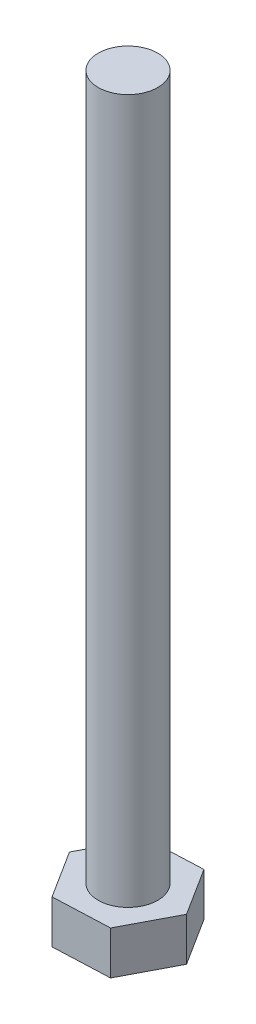
ISO-10303-21;
HEADER;
FILE_DESCRIPTION(('STEP AP214'),'2;1');
FILE_NAME('part.step','',(''),(''),'','','');
FILE_SCHEMA(('AUTOMOTIVE_DESIGN { 1 0 10303 214 1 1 1 1 }'));
ENDSEC;
DATA;
#1=APPLICATION_CONTEXT('core data for automotive mechanical design processes');
#2=APPLICATION_PROTOCOL_DEFINITION('international standard','automotive_design',2000,#1);
#3=PRODUCT_CONTEXT('',#1,'mechanical');
#4=PRODUCT('Part','Part','',(#3));
#5=PRODUCT_RELATED_PRODUCT_CATEGORY('part','',(#4));
#6=PRODUCT_DEFINITION_FORMATION('','',#4);
#7=PRODUCT_DEFINITION_CONTEXT('part definition',#1,'design');
#8=PRODUCT_DEFINITION('design','',#6,#7);
#9=PRODUCT_DEFINITION_SHAPE('','',#8);
#10=(LENGTH_UNIT() NAMED_UNIT(*) SI_UNIT(.MILLI.,.METRE.));
#11=(NAMED_UNIT(*) PLANE_ANGLE_UNIT() SI_UNIT($,.RADIAN.));
#12=(NAMED_UNIT(*) SI_UNIT($,.STERADIAN.) SOLID_ANGLE_UNIT());
#13=UNCERTAINTY_MEASURE_WITH_UNIT(LENGTH_MEASURE(1.E-05),#10,'distance_accuracy_value','');
#14=(GEOMETRIC_REPRESENTATION_CONTEXT(3) GLOBAL_UNCERTAINTY_ASSIGNED_CONTEXT((#13)) GLOBAL_UNIT_ASSIGNED_CONTEXT((#10,
#11,#12)) REPRESENTATION_CONTEXT('',''));
#15=CARTESIAN_POINT('',(0.,0.,0.));
#16=DIRECTION('',(0.,0.,1.));
#17=DIRECTION('',(1.,0.,0.));
#18=AXIS2_PLACEMENT_3D('',#15,#16,#17);
#19=CARTESIAN_POINT('',(4.82045610999337,8.,-9.2066933744764));
#20=DIRECTION('',(0.0412525656755766,0.,0.99914875059982));
#21=DIRECTION('',(0.99914875059982,0.,-0.0412525656755766));
#22=AXIS2_PLACEMENT_3D('',#19,#20,#21);
#23=PLANE('',#22);
#24=DIRECTION('',(-0.99914875059982,0.,0.0412525656755766));
#25=VECTOR('',#24,1.);
#26=CARTESIAN_POINT('',(4.82045610999337,0.,-9.2066933744764));
#27=LINE('',#26,#25);
#28=CARTESIAN_POINT('',(4.82045610999337,0.,-9.2066933744764));
#29=VERTEX_POINT('',#28);
#30=CARTESIAN_POINT('',(-5.56300229215375,0.,-8.77798413632038));
#31=VERTEX_POINT('',#30);
#32=EDGE_CURVE('E127',#29,#31,#27,.T.);
#33=ORIENTED_EDGE('',*,*,#32,.T.);
#34=DIRECTION('',(0.,-1.,0.));
#35=VECTOR('',#34,1.);
#36=CARTESIAN_POINT('',(-5.56300229215375,8.,-8.77798413632038));
#37=LINE('',#36,#35);
#38=CARTESIAN_POINT('',(-5.56300229215375,8.,-8.77798413632038));
#39=VERTEX_POINT('',#38);
#40=EDGE_CURVE('E44',#39,#31,#37,.T.);
#41=ORIENTED_EDGE('',*,*,#40,.F.);
#42=DIRECTION('',(-0.99914875059982,0.,0.0412525656755766));
#43=VECTOR('',#42,1.);
#44=CARTESIAN_POINT('',(4.82045610999337,8.,-9.2066933744764));
#45=LINE('',#44,#43);
#46=CARTESIAN_POINT('',(4.82045610999337,8.,-9.2066933744764));
#47=VERTEX_POINT('',#46);
#48=EDGE_CURVE('E138',#47,#39,#45,.T.);
#49=ORIENTED_EDGE('',*,*,#48,.F.);
#50=DIRECTION('',(0.,-1.,0.));
#51=VECTOR('',#50,1.);
#52=CARTESIAN_POINT('',(4.82045610999337,8.,-9.2066933744764));
#53=LINE('',#52,#51);
#54=EDGE_CURVE('E123',#47,#29,#53,.T.);
#55=ORIENTED_EDGE('',*,*,#54,.T.);
#56=EDGE_LOOP('',(#33,#41,#49,#55));
#57=FACE_BOUND('',#56,.T.);
#58=ADVANCED_FACE('F41',(#57),#23,.F.);
#59=CARTESIAN_POINT('',(-5.56300229215375,8.,-8.77798413632038));
#60=DIRECTION('',(0.885914483016715,0.,0.463848605453575));
#61=DIRECTION('',(0.463848605453575,0.,-0.885914483016715));
#62=AXIS2_PLACEMENT_3D('',#59,#60,#61);
#63=PLANE('',#62);
#64=DIRECTION('',(-0.463848605453575,0.,0.885914483016715));
#65=VECTOR('',#64,1.);
#66=CARTESIAN_POINT('',(-5.56300229215375,0.,-8.77798413632038));
#67=LINE('',#66,#65);
#68=CARTESIAN_POINT('',(-10.3834584021471,0.,0.428709238156027));
#69=VERTEX_POINT('',#68);
#70=EDGE_CURVE('E130',#31,#69,#67,.T.);
#71=ORIENTED_EDGE('',*,*,#70,.T.);
#72=DIRECTION('',(0.,-1.,0.));
#73=VECTOR('',#72,1.);
#74=CARTESIAN_POINT('',(-10.3834584021471,8.,0.428709238156027));
#75=LINE('',#74,#73);
#76=CARTESIAN_POINT('',(-10.3834584021471,8.,0.428709238156027));
#77=VERTEX_POINT('',#76);
#78=EDGE_CURVE('E141',#77,#69,#75,.T.);
#79=ORIENTED_EDGE('',*,*,#78,.F.);
#80=DIRECTION('',(-0.463848605453575,0.,0.885914483016715));
#81=VECTOR('',#80,1.);
#82=CARTESIAN_POINT('',(-5.56300229215375,8.,-8.77798413632038));
#83=LINE('',#82,#81);
#84=EDGE_CURVE('E96',#39,#77,#83,.T.);
#85=ORIENTED_EDGE('',*,*,#84,.F.);
#86=ORIENTED_EDGE('',*,*,#40,.T.);
#87=EDGE_LOOP('',(#71,#79,#85,#86));
#88=FACE_BOUND('',#87,.T.);
#89=ADVANCED_FACE('F146',(#88),#63,.F.);
#90=CARTESIAN_POINT('',(-10.3834584021471,8.,0.428709238156027));
#91=DIRECTION('',(0.844661917341139,0.,-0.535300145146246));
#92=DIRECTION('',(-0.535300145146246,0.,-0.844661917341139));
#93=AXIS2_PLACEMENT_3D('',#90,#91,#92);
#94=PLANE('',#93);
#95=DIRECTION('',(0.535300145146246,0.,0.844661917341139));
#96=VECTOR('',#95,1.);
#97=CARTESIAN_POINT('',(-10.3834584021471,0.,0.428709238156027));
#98=LINE('',#97,#96);
#99=CARTESIAN_POINT('',(-4.82045610999337,0.,9.2066933744764));
#100=VERTEX_POINT('',#99);
#101=EDGE_CURVE('E133',#69,#100,#98,.T.);
#102=ORIENTED_EDGE('',*,*,#101,.T.);
#103=DIRECTION('',(0.,-1.,0.));
#104=VECTOR('',#103,1.);
#105=CARTESIAN_POINT('',(-4.82045610999337,8.,9.2066933744764));
#106=LINE('',#105,#104);
#107=CARTESIAN_POINT('',(-4.82045610999337,8.,9.2066933744764));
#108=VERTEX_POINT('',#107);
#109=EDGE_CURVE('E118',#108,#100,#106,.T.);
#110=ORIENTED_EDGE('',*,*,#109,.F.);
#111=DIRECTION('',(0.535300145146246,0.,0.844661917341139));
#112=VECTOR('',#111,1.);
#113=CARTESIAN_POINT('',(-10.3834584021471,8.,0.428709238156027));
#114=LINE('',#113,#112);
#115=EDGE_CURVE('E109',#77,#108,#114,.T.);
#116=ORIENTED_EDGE('',*,*,#115,.F.);
#117=ORIENTED_EDGE('',*,*,#78,.T.);
#118=EDGE_LOOP('',(#102,#110,#116,#117));
#119=FACE_BOUND('',#118,.T.);
#120=ADVANCED_FACE('F152',(#119),#94,.F.);
#121=CARTESIAN_POINT('',(-4.82045610999337,8.,9.2066933744764));
#122=DIRECTION('',(-0.0412525656755766,0.,-0.99914875059982));
#123=DIRECTION('',(-0.99914875059982,0.,0.0412525656755766));
#124=AXIS2_PLACEMENT_3D('',#121,#122,#123);
#125=PLANE('',#124);
#126=DIRECTION('',(0.99914875059982,0.,-0.0412525656755766));
#127=VECTOR('',#126,1.);
#128=CARTESIAN_POINT('',(-4.82045610999337,0.,9.2066933744764));
#129=LINE('',#128,#127);
#130=CARTESIAN_POINT('',(5.56300229215375,0.,8.77798413632038));
#131=VERTEX_POINT('',#130);
#132=EDGE_CURVE('E117',#100,#131,#129,.T.);
#133=ORIENTED_EDGE('',*,*,#132,.T.);
#134=DIRECTION('',(0.,-1.,0.));
#135=VECTOR('',#134,1.);
#136=CARTESIAN_POINT('',(5.56300229215375,8.,8.77798413632038));
#137=LINE('',#136,#135);
#138=CARTESIAN_POINT('',(5.56300229215375,8.,8.77798413632038));
#139=VERTEX_POINT('',#138);
#140=EDGE_CURVE('E114',#139,#131,#137,.T.);
#141=ORIENTED_EDGE('',*,*,#140,.F.);
#142=DIRECTION('',(0.99914875059982,0.,-0.0412525656755766));
#143=VECTOR('',#142,1.);
#144=CARTESIAN_POINT('',(-4.82045610999337,8.,9.2066933744764));
#145=LINE('',#144,#143);
#146=EDGE_CURVE('E103',#108,#139,#145,.T.);
#147=ORIENTED_EDGE('',*,*,#146,.F.);
#148=ORIENTED_EDGE('',*,*,#109,.T.);
#149=EDGE_LOOP('',(#133,#141,#147,#148));
#150=FACE_BOUND('',#149,.T.);
#151=ADVANCED_FACE('F115',(#150),#125,.F.);
#152=CARTESIAN_POINT('',(5.56300229215375,8.,8.77798413632038));
#153=DIRECTION('',(-0.885914483016715,0.,-0.463848605453575));
#154=DIRECTION('',(-0.463848605453575,0.,0.885914483016715));
#155=AXIS2_PLACEMENT_3D('',#152,#153,#154);
#156=PLANE('',#155);
#157=DIRECTION('',(0.463848605453575,0.,-0.885914483016715));
#158=VECTOR('',#157,1.);
#159=CARTESIAN_POINT('',(5.56300229215375,0.,8.77798413632038));
#160=LINE('',#159,#158);
#161=CARTESIAN_POINT('',(10.3834584021471,0.,-0.428709238156026));
#162=VERTEX_POINT('',#161);
#163=EDGE_CURVE('E81',#131,#162,#160,.T.);
#164=ORIENTED_EDGE('',*,*,#163,.T.);
#165=DIRECTION('',(0.,-1.,0.));
#166=VECTOR('',#165,1.);
#167=CARTESIAN_POINT('',(10.3834584021471,8.,-0.428709238156026));
#168=LINE('',#167,#166);
#169=CARTESIAN_POINT('',(10.3834584021471,8.,-0.428709238156026));
#170=VERTEX_POINT('',#169);
#171=EDGE_CURVE('E119',#170,#162,#168,.T.);
#172=ORIENTED_EDGE('',*,*,#171,.F.);
#173=DIRECTION('',(0.463848605453575,0.,-0.885914483016715));
#174=VECTOR('',#173,1.);
#175=CARTESIAN_POINT('',(5.56300229215375,8.,8.77798413632038));
#176=LINE('',#175,#174);
#177=EDGE_CURVE('E107',#139,#170,#176,.T.);
#178=ORIENTED_EDGE('',*,*,#177,.F.);
#179=ORIENTED_EDGE('',*,*,#140,.T.);
#180=EDGE_LOOP('',(#164,#172,#178,#179));
#181=FACE_BOUND('',#180,.T.);
#182=ADVANCED_FACE('F121',(#181),#156,.F.);
#183=CARTESIAN_POINT('',(10.3834584021471,8.,-0.428709238156026));
#184=DIRECTION('',(-0.844661917341139,0.,0.535300145146246));
#185=DIRECTION('',(0.535300145146246,0.,0.844661917341139));
#186=AXIS2_PLACEMENT_3D('',#183,#184,#185);
#187=PLANE('',#186);
#188=DIRECTION('',(-0.535300145146246,0.,-0.844661917341139));
#189=VECTOR('',#188,1.);
#190=CARTESIAN_POINT('',(10.3834584021471,0.,-0.428709238156026));
#191=LINE('',#190,#189);
#192=EDGE_CURVE('E87',#162,#29,#191,.T.);
#193=ORIENTED_EDGE('',*,*,#192,.T.);
#194=ORIENTED_EDGE('',*,*,#54,.F.);
#195=DIRECTION('',(-0.535300145146246,0.,-0.844661917341139));
#196=VECTOR('',#195,1.);
#197=CARTESIAN_POINT('',(10.3834584021471,8.,-0.428709238156026));
#198=LINE('',#197,#196);
#199=EDGE_CURVE('E58',#170,#47,#198,.T.);
#200=ORIENTED_EDGE('',*,*,#199,.F.);
#201=ORIENTED_EDGE('',*,*,#171,.T.);
#202=EDGE_LOOP('',(#193,#194,#200,#201));
#203=FACE_BOUND('',#202,.T.);
#204=ADVANCED_FACE('F168',(#203),#187,.F.);
#205=CARTESIAN_POINT('',(0.,8.,0.));
#206=DIRECTION('',(0.,1.,0.));
#207=DIRECTION('',(0.,0.,1.));
#208=AXIS2_PLACEMENT_3D('',#205,#206,#207);
#209=PLANE('',#208);
#210=CARTESIAN_POINT('',(0.,8.,0.));
#211=DIRECTION('',(0.,1.,0.));
#212=DIRECTION('',(0.,0.,1.));
#213=AXIS2_PLACEMENT_3D('',#210,#211,#212);
#214=CIRCLE('',#213,5.5);
#215=CARTESIAN_POINT('',(0.,8.,5.5));
#216=VERTEX_POINT('',#215);
#217=EDGE_CURVE('E11',#216,#216,#214,.T.);
#218=ORIENTED_EDGE('',*,*,#217,.F.);
#219=EDGE_LOOP('',(#218));
#220=FACE_BOUND('',#219,.T.);
#221=ORIENTED_EDGE('',*,*,#48,.T.);
#222=ORIENTED_EDGE('',*,*,#84,.T.);
#223=ORIENTED_EDGE('',*,*,#115,.T.);
#224=ORIENTED_EDGE('',*,*,#146,.T.);
#225=ORIENTED_EDGE('',*,*,#177,.T.);
#226=ORIENTED_EDGE('',*,*,#199,.T.);
#227=EDGE_LOOP('',(#221,#222,#223,#224,#225,#226));
#228=FACE_BOUND('',#227,.T.);
#229=ADVANCED_FACE('F105',(#220,#228),#209,.T.);
#230=CARTESIAN_POINT('',(0.,0.,0.));
#231=DIRECTION('',(0.,1.,0.));
#232=DIRECTION('',(0.,0.,1.));
#233=AXIS2_PLACEMENT_3D('',#230,#231,#232);
#234=PLANE('',#233);
#235=ORIENTED_EDGE('',*,*,#32,.F.);
#236=ORIENTED_EDGE('',*,*,#192,.F.);
#237=ORIENTED_EDGE('',*,*,#163,.F.);
#238=ORIENTED_EDGE('',*,*,#132,.F.);
#239=ORIENTED_EDGE('',*,*,#101,.F.);
#240=ORIENTED_EDGE('',*,*,#70,.F.);
#241=EDGE_LOOP('',(#235,#236,#237,#238,#239,#240));
#242=FACE_BOUND('',#241,.T.);
#243=ADVANCED_FACE('F151',(#242),#234,.F.);
#244=CARTESIAN_POINT('',(0.,138.,0.));
#245=DIRECTION('',(0.,-1.,0.));
#246=DIRECTION('',(0.,0.,-1.));
#247=AXIS2_PLACEMENT_3D('',#244,#245,#246);
#248=CYLINDRICAL_SURFACE('',#247,5.5);
#249=CARTESIAN_POINT('',(0.,138.,0.));
#250=DIRECTION('',(0.,1.,0.));
#251=DIRECTION('',(0.,0.,1.));
#252=AXIS2_PLACEMENT_3D('',#249,#250,#251);
#253=CIRCLE('',#252,5.5);
#254=CARTESIAN_POINT('',(0.,138.,5.5));
#255=VERTEX_POINT('',#254);
#256=EDGE_CURVE('E131',#255,#255,#253,.T.);
#257=ORIENTED_EDGE('',*,*,#256,.F.);
#258=EDGE_LOOP('',(#257));
#259=FACE_BOUND('',#258,.T.);
#260=ORIENTED_EDGE('',*,*,#217,.T.);
#261=EDGE_LOOP('',(#260));
#262=FACE_BOUND('',#261,.T.);
#263=ADVANCED_FACE('F161',(#259,#262),#248,.T.);
#264=CARTESIAN_POINT('',(0.,138.,0.));
#265=DIRECTION('',(0.,1.,0.));
#266=DIRECTION('',(0.,0.,1.));
#267=AXIS2_PLACEMENT_3D('',#264,#265,#266);
#268=PLANE('',#267);
#269=ORIENTED_EDGE('',*,*,#256,.T.);
#270=EDGE_LOOP('',(#269));
#271=FACE_BOUND('',#270,.T.);
#272=ADVANCED_FACE('F159',(#271),#268,.T.);
#273=CLOSED_SHELL('',(#58,#89,#120,#151,#182,#204,#229,#243,#263,#272));
#274=MANIFOLD_SOLID_BREP('B2',#273);
#275=ADVANCED_BREP_SHAPE_REPRESENTATION('',(#18,#274),#14);
#276=SHAPE_DEFINITION_REPRESENTATION(#9,#275);
ENDSEC;
END-ISO-10303-21;
